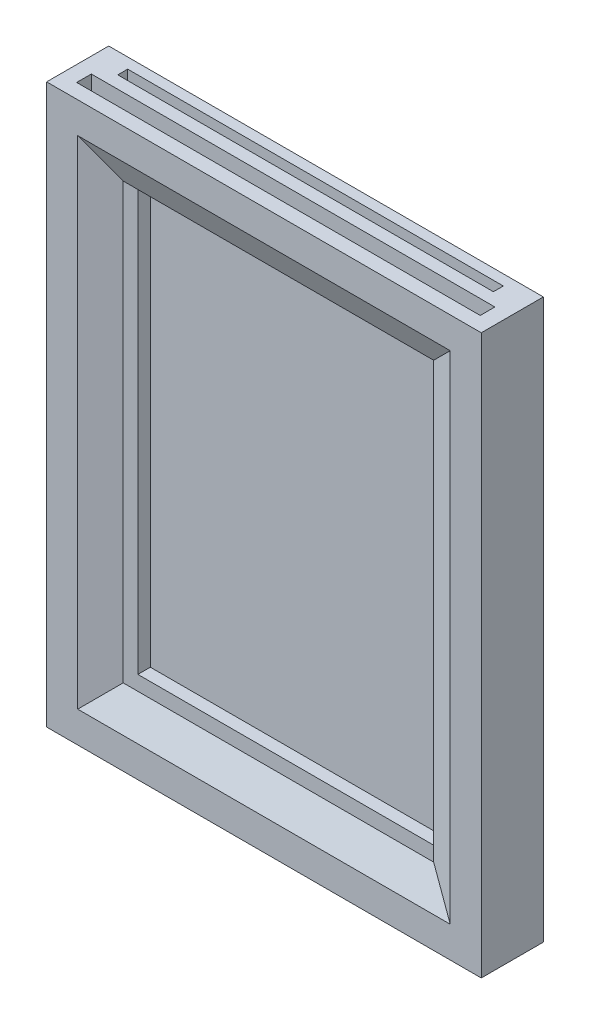
ISO-10303-21;
HEADER;
FILE_DESCRIPTION(('STEP AP214'),'2;1');
FILE_NAME('part.step','',(''),(''),'','','');
FILE_SCHEMA(('AUTOMOTIVE_DESIGN { 1 0 10303 214 1 1 1 1 }'));
ENDSEC;
DATA;
#1=APPLICATION_CONTEXT('core data for automotive mechanical design processes');
#2=APPLICATION_PROTOCOL_DEFINITION('international standard','automotive_design',2000,#1);
#3=PRODUCT_CONTEXT('',#1,'mechanical');
#4=PRODUCT('Part','Part','',(#3));
#5=PRODUCT_RELATED_PRODUCT_CATEGORY('part','',(#4));
#6=PRODUCT_DEFINITION_FORMATION('','',#4);
#7=PRODUCT_DEFINITION_CONTEXT('part definition',#1,'design');
#8=PRODUCT_DEFINITION('design','',#6,#7);
#9=PRODUCT_DEFINITION_SHAPE('','',#8);
#10=(LENGTH_UNIT() NAMED_UNIT(*) SI_UNIT(.MILLI.,.METRE.));
#11=(NAMED_UNIT(*) PLANE_ANGLE_UNIT() SI_UNIT($,.RADIAN.));
#12=(NAMED_UNIT(*) SI_UNIT($,.STERADIAN.) SOLID_ANGLE_UNIT());
#13=UNCERTAINTY_MEASURE_WITH_UNIT(LENGTH_MEASURE(1.E-05),#10,'distance_accuracy_value','');
#14=(GEOMETRIC_REPRESENTATION_CONTEXT(3) GLOBAL_UNCERTAINTY_ASSIGNED_CONTEXT((#13)) GLOBAL_UNIT_ASSIGNED_CONTEXT((#10,
#11,#12)) REPRESENTATION_CONTEXT('',''));
#15=CARTESIAN_POINT('',(0.,0.,0.));
#16=DIRECTION('',(0.,0.,1.));
#17=DIRECTION('',(1.,0.,0.));
#18=AXIS2_PLACEMENT_3D('',#15,#16,#17);
#19=CARTESIAN_POINT('',(0.,0.,12.7));
#20=DIRECTION('',(1.,0.,0.));
#21=DIRECTION('',(0.,0.,-1.));
#22=AXIS2_PLACEMENT_3D('',#19,#20,#21);
#23=PLANE('',#22);
#24=DIRECTION('',(0.,-1.,0.));
#25=VECTOR('',#24,1.);
#26=CARTESIAN_POINT('',(0.,0.,0.));
#27=LINE('',#26,#25);
#28=CARTESIAN_POINT('',(0.,114.3,0.));
#29=VERTEX_POINT('',#28);
#30=CARTESIAN_POINT('',(0.,0.,0.));
#31=VERTEX_POINT('',#30);
#32=EDGE_CURVE('E302',#29,#31,#27,.T.);
#33=ORIENTED_EDGE('',*,*,#32,.T.);
#34=DIRECTION('',(0.,0.,-1.));
#35=VECTOR('',#34,1.);
#36=CARTESIAN_POINT('',(0.,0.,12.7));
#37=LINE('',#36,#35);
#38=CARTESIAN_POINT('',(0.,0.,12.7));
#39=VERTEX_POINT('',#38);
#40=EDGE_CURVE('E352',#39,#31,#37,.T.);
#41=ORIENTED_EDGE('',*,*,#40,.F.);
#42=DIRECTION('',(0.,-1.,0.));
#43=VECTOR('',#42,1.);
#44=CARTESIAN_POINT('',(0.,0.,12.7));
#45=LINE('',#44,#43);
#46=CARTESIAN_POINT('',(0.,114.3,12.7));
#47=VERTEX_POINT('',#46);
#48=EDGE_CURVE('E313',#47,#39,#45,.T.);
#49=ORIENTED_EDGE('',*,*,#48,.F.);
#50=DIRECTION('',(0.,0.,-1.));
#51=VECTOR('',#50,1.);
#52=CARTESIAN_POINT('',(0.,114.3,12.7));
#53=LINE('',#52,#51);
#54=EDGE_CURVE('E326',#47,#29,#53,.T.);
#55=ORIENTED_EDGE('',*,*,#54,.T.);
#56=EDGE_LOOP('',(#33,#41,#49,#55));
#57=FACE_BOUND('',#56,.T.);
#58=ADVANCED_FACE('F52',(#57),#23,.F.);
#59=CARTESIAN_POINT('',(0.,0.,12.7));
#60=DIRECTION('',(0.,1.,0.));
#61=DIRECTION('',(0.,0.,1.));
#62=AXIS2_PLACEMENT_3D('',#59,#60,#61);
#63=PLANE('',#62);
#64=DIRECTION('',(1.,0.,0.));
#65=VECTOR('',#64,1.);
#66=CARTESIAN_POINT('',(0.,0.,0.));
#67=LINE('',#66,#65);
#68=CARTESIAN_POINT('',(88.9,0.,0.));
#69=VERTEX_POINT('',#68);
#70=EDGE_CURVE('E334',#31,#69,#67,.T.);
#71=ORIENTED_EDGE('',*,*,#70,.T.);
#72=DIRECTION('',(0.,0.,-1.));
#73=VECTOR('',#72,1.);
#74=CARTESIAN_POINT('',(88.9,0.,12.7));
#75=LINE('',#74,#73);
#76=CARTESIAN_POINT('',(88.9,0.,12.7));
#77=VERTEX_POINT('',#76);
#78=EDGE_CURVE('E350',#77,#69,#75,.T.);
#79=ORIENTED_EDGE('',*,*,#78,.F.);
#80=DIRECTION('',(1.,0.,0.));
#81=VECTOR('',#80,1.);
#82=CARTESIAN_POINT('',(0.,0.,12.7));
#83=LINE('',#82,#81);
#84=EDGE_CURVE('E319',#39,#77,#83,.T.);
#85=ORIENTED_EDGE('',*,*,#84,.F.);
#86=ORIENTED_EDGE('',*,*,#40,.T.);
#87=EDGE_LOOP('',(#71,#79,#85,#86));
#88=FACE_BOUND('',#87,.T.);
#89=ADVANCED_FACE('F441',(#88),#63,.F.);
#90=CARTESIAN_POINT('',(88.9,0.,12.7));
#91=DIRECTION('',(-1.,0.,0.));
#92=DIRECTION('',(0.,0.,1.));
#93=AXIS2_PLACEMENT_3D('',#90,#91,#92);
#94=PLANE('',#93);
#95=DIRECTION('',(0.,1.,0.));
#96=VECTOR('',#95,1.);
#97=CARTESIAN_POINT('',(88.9,0.,0.));
#98=LINE('',#97,#96);
#99=CARTESIAN_POINT('',(88.9,114.3,0.));
#100=VERTEX_POINT('',#99);
#101=EDGE_CURVE('E333',#69,#100,#98,.T.);
#102=ORIENTED_EDGE('',*,*,#101,.T.);
#103=DIRECTION('',(0.,0.,-1.));
#104=VECTOR('',#103,1.);
#105=CARTESIAN_POINT('',(88.9,114.3,12.7));
#106=LINE('',#105,#104);
#107=CARTESIAN_POINT('',(88.9,114.3,12.7));
#108=VERTEX_POINT('',#107);
#109=EDGE_CURVE('E345',#108,#100,#106,.T.);
#110=ORIENTED_EDGE('',*,*,#109,.F.);
#111=DIRECTION('',(0.,1.,0.));
#112=VECTOR('',#111,1.);
#113=CARTESIAN_POINT('',(88.9,0.,12.7));
#114=LINE('',#113,#112);
#115=EDGE_CURVE('E321',#77,#108,#114,.T.);
#116=ORIENTED_EDGE('',*,*,#115,.F.);
#117=ORIENTED_EDGE('',*,*,#78,.T.);
#118=EDGE_LOOP('',(#102,#110,#116,#117));
#119=FACE_BOUND('',#118,.T.);
#120=ADVANCED_FACE('F450',(#119),#94,.F.);
#121=CARTESIAN_POINT('',(0.,114.3,12.7));
#122=DIRECTION('',(0.,-1.,0.));
#123=DIRECTION('',(0.,0.,-1.));
#124=AXIS2_PLACEMENT_3D('',#121,#122,#123);
#125=PLANE('',#124);
#126=DIRECTION('',(1.,0.,0.));
#127=VECTOR('',#126,1.);
#128=CARTESIAN_POINT('',(3.175,114.3,9.73894637071576));
#129=LINE('',#128,#127);
#130=CARTESIAN_POINT('',(3.175,114.3,9.73894637071576));
#131=VERTEX_POINT('',#130);
#132=CARTESIAN_POINT('',(85.725,114.3,9.73894637071575));
#133=VERTEX_POINT('',#132);
#134=EDGE_CURVE('E227',#131,#133,#129,.T.);
#135=ORIENTED_EDGE('',*,*,#134,.F.);
#136=DIRECTION('',(0.,0.,1.));
#137=VECTOR('',#136,1.);
#138=CARTESIAN_POINT('',(3.175,114.3,9.73894637071576));
#139=LINE('',#138,#137);
#140=CARTESIAN_POINT('',(3.175,114.3,6.73894637071576));
#141=VERTEX_POINT('',#140);
#142=EDGE_CURVE('E67',#141,#131,#139,.T.);
#143=ORIENTED_EDGE('',*,*,#142,.F.);
#144=DIRECTION('',(-1.,0.,0.));
#145=VECTOR('',#144,1.);
#146=CARTESIAN_POINT('',(3.175,114.3,6.73894637071576));
#147=LINE('',#146,#145);
#148=CARTESIAN_POINT('',(85.725,114.3,6.73894637071575));
#149=VERTEX_POINT('',#148);
#150=EDGE_CURVE('E213',#149,#141,#147,.T.);
#151=ORIENTED_EDGE('',*,*,#150,.F.);
#152=DIRECTION('',(0.,0.,-1.));
#153=VECTOR('',#152,1.);
#154=CARTESIAN_POINT('',(85.725,114.3,9.73894637071575));
#155=LINE('',#154,#153);
#156=EDGE_CURVE('E216',#133,#149,#155,.T.);
#157=ORIENTED_EDGE('',*,*,#156,.F.);
#158=EDGE_LOOP('',(#135,#143,#151,#157));
#159=FACE_BOUND('',#158,.T.);
#160=DIRECTION('',(1.,0.,0.));
#161=VECTOR('',#160,1.);
#162=CARTESIAN_POINT('',(6.0325,114.3,4.19100000000001));
#163=LINE('',#162,#161);
#164=CARTESIAN_POINT('',(6.0325,114.3,4.19100000000001));
#165=VERTEX_POINT('',#164);
#166=CARTESIAN_POINT('',(82.8675,114.3,4.19099999999999));
#167=VERTEX_POINT('',#166);
#168=EDGE_CURVE('E288',#165,#167,#163,.T.);
#169=ORIENTED_EDGE('',*,*,#168,.F.);
#170=DIRECTION('',(0.,0.,1.));
#171=VECTOR('',#170,1.);
#172=CARTESIAN_POINT('',(6.0325,114.3,4.19100000000001));
#173=LINE('',#172,#171);
#174=CARTESIAN_POINT('',(6.0325,114.3,2.159));
#175=VERTEX_POINT('',#174);
#176=EDGE_CURVE('E259',#175,#165,#173,.T.);
#177=ORIENTED_EDGE('',*,*,#176,.F.);
#178=DIRECTION('',(-1.,0.,0.));
#179=VECTOR('',#178,1.);
#180=CARTESIAN_POINT('',(6.0325,114.3,2.159));
#181=LINE('',#180,#179);
#182=CARTESIAN_POINT('',(82.8675,114.3,2.159));
#183=VERTEX_POINT('',#182);
#184=EDGE_CURVE('E273',#183,#175,#181,.T.);
#185=ORIENTED_EDGE('',*,*,#184,.F.);
#186=DIRECTION('',(0.,0.,-1.));
#187=VECTOR('',#186,1.);
#188=CARTESIAN_POINT('',(82.8675,114.3,4.19099999999999));
#189=LINE('',#188,#187);
#190=EDGE_CURVE('E295',#167,#183,#189,.T.);
#191=ORIENTED_EDGE('',*,*,#190,.F.);
#192=EDGE_LOOP('',(#169,#177,#185,#191));
#193=FACE_BOUND('',#192,.T.);
#194=DIRECTION('',(-1.,0.,0.));
#195=VECTOR('',#194,1.);
#196=CARTESIAN_POINT('',(0.,114.3,0.));
#197=LINE('',#196,#195);
#198=EDGE_CURVE('E316',#100,#29,#197,.T.);
#199=ORIENTED_EDGE('',*,*,#198,.T.);
#200=ORIENTED_EDGE('',*,*,#54,.F.);
#201=DIRECTION('',(-1.,0.,0.));
#202=VECTOR('',#201,1.);
#203=CARTESIAN_POINT('',(0.,114.3,12.7));
#204=LINE('',#203,#202);
#205=EDGE_CURVE('E322',#108,#47,#204,.T.);
#206=ORIENTED_EDGE('',*,*,#205,.F.);
#207=ORIENTED_EDGE('',*,*,#109,.T.);
#208=EDGE_LOOP('',(#199,#200,#206,#207));
#209=FACE_BOUND('',#208,.T.);
#210=ADVANCED_FACE('F512',(#159,#193,#209),#125,.F.);
#211=CARTESIAN_POINT('',(0.,0.,12.7));
#212=DIRECTION('',(0.,0.,-1.));
#213=DIRECTION('',(-1.,0.,0.));
#214=AXIS2_PLACEMENT_3D('',#211,#212,#213);
#215=PLANE('',#214);
#216=DIRECTION('',(0.,-1.,0.));
#217=VECTOR('',#216,1.);
#218=CARTESIAN_POINT('',(82.55,0.,12.7));
#219=LINE('',#218,#217);
#220=CARTESIAN_POINT('',(82.55,107.95,12.7));
#221=VERTEX_POINT('',#220);
#222=CARTESIAN_POINT('',(82.55,6.34999999999999,12.7));
#223=VERTEX_POINT('',#222);
#224=EDGE_CURVE('E379',#221,#223,#219,.T.);
#225=ORIENTED_EDGE('',*,*,#224,.T.);
#226=DIRECTION('',(-1.,0.,0.));
#227=VECTOR('',#226,1.);
#228=CARTESIAN_POINT('',(0.,6.34999999999998,12.7));
#229=LINE('',#228,#227);
#230=CARTESIAN_POINT('',(6.35,6.34999999999998,12.7));
#231=VERTEX_POINT('',#230);
#232=EDGE_CURVE('E384',#223,#231,#229,.T.);
#233=ORIENTED_EDGE('',*,*,#232,.T.);
#234=DIRECTION('',(0.,1.,0.));
#235=VECTOR('',#234,1.);
#236=CARTESIAN_POINT('',(6.35,0.,12.7));
#237=LINE('',#236,#235);
#238=CARTESIAN_POINT('',(6.35,107.95,12.7));
#239=VERTEX_POINT('',#238);
#240=EDGE_CURVE('E372',#231,#239,#237,.T.);
#241=ORIENTED_EDGE('',*,*,#240,.T.);
#242=DIRECTION('',(1.,0.,0.));
#243=VECTOR('',#242,1.);
#244=CARTESIAN_POINT('',(0.,107.95,12.7));
#245=LINE('',#244,#243);
#246=EDGE_CURVE('E380',#239,#221,#245,.T.);
#247=ORIENTED_EDGE('',*,*,#246,.T.);
#248=EDGE_LOOP('',(#225,#233,#241,#247));
#249=FACE_BOUND('',#248,.T.);
#250=ORIENTED_EDGE('',*,*,#48,.T.);
#251=ORIENTED_EDGE('',*,*,#84,.T.);
#252=ORIENTED_EDGE('',*,*,#115,.T.);
#253=ORIENTED_EDGE('',*,*,#205,.T.);
#254=EDGE_LOOP('',(#250,#251,#252,#253));
#255=FACE_BOUND('',#254,.T.);
#256=ADVANCED_FACE('F420',(#249,#255),#215,.F.);
#257=CARTESIAN_POINT('',(0.,0.,0.));
#258=DIRECTION('',(0.,0.,-1.));
#259=DIRECTION('',(-1.,0.,0.));
#260=AXIS2_PLACEMENT_3D('',#257,#258,#259);
#261=PLANE('',#260);
#262=ORIENTED_EDGE('',*,*,#32,.F.);
#263=ORIENTED_EDGE('',*,*,#198,.F.);
#264=ORIENTED_EDGE('',*,*,#101,.F.);
#265=ORIENTED_EDGE('',*,*,#70,.F.);
#266=EDGE_LOOP('',(#262,#263,#264,#265));
#267=FACE_BOUND('',#266,.T.);
#268=ADVANCED_FACE('F510',(#267),#261,.T.);
#269=CARTESIAN_POINT('',(6.0325,8.89,4.19100000000001));
#270=DIRECTION('',(-1.,0.,0.));
#271=DIRECTION('',(0.,0.,1.));
#272=AXIS2_PLACEMENT_3D('',#269,#270,#271);
#273=PLANE('',#272);
#274=ORIENTED_EDGE('',*,*,#176,.T.);
#275=DIRECTION('',(0.,1.,0.));
#276=VECTOR('',#275,1.);
#277=CARTESIAN_POINT('',(6.0325,8.89,4.19100000000001));
#278=LINE('',#277,#276);
#279=CARTESIAN_POINT('',(6.0325,8.89,4.19100000000001));
#280=VERTEX_POINT('',#279);
#281=EDGE_CURVE('E289',#280,#165,#278,.T.);
#282=ORIENTED_EDGE('',*,*,#281,.F.);
#283=DIRECTION('',(0.,0.,1.));
#284=VECTOR('',#283,1.);
#285=CARTESIAN_POINT('',(6.0325,8.89,4.19100000000001));
#286=LINE('',#285,#284);
#287=CARTESIAN_POINT('',(6.0325,8.89,2.159));
#288=VERTEX_POINT('',#287);
#289=EDGE_CURVE('E268',#288,#280,#286,.T.);
#290=ORIENTED_EDGE('',*,*,#289,.F.);
#291=DIRECTION('',(0.,1.,0.));
#292=VECTOR('',#291,1.);
#293=CARTESIAN_POINT('',(6.0325,8.89,2.159));
#294=LINE('',#293,#292);
#295=EDGE_CURVE('E301',#288,#175,#294,.T.);
#296=ORIENTED_EDGE('',*,*,#295,.T.);
#297=EDGE_LOOP('',(#274,#282,#290,#296));
#298=FACE_BOUND('',#297,.T.);
#299=ADVANCED_FACE('F500',(#298),#273,.F.);
#300=CARTESIAN_POINT('',(6.0325,8.89,2.159));
#301=DIRECTION('',(0.,0.,-1.));
#302=DIRECTION('',(-1.,0.,0.));
#303=AXIS2_PLACEMENT_3D('',#300,#301,#302);
#304=PLANE('',#303);
#305=ORIENTED_EDGE('',*,*,#184,.T.);
#306=ORIENTED_EDGE('',*,*,#295,.F.);
#307=DIRECTION('',(-1.,0.,0.));
#308=VECTOR('',#307,1.);
#309=CARTESIAN_POINT('',(6.0325,8.89,2.159));
#310=LINE('',#309,#308);
#311=CARTESIAN_POINT('',(82.8675,8.89,2.159));
#312=VERTEX_POINT('',#311);
#313=EDGE_CURVE('E281',#312,#288,#310,.T.);
#314=ORIENTED_EDGE('',*,*,#313,.F.);
#315=DIRECTION('',(0.,1.,0.));
#316=VECTOR('',#315,1.);
#317=CARTESIAN_POINT('',(82.8675,8.89,2.159));
#318=LINE('',#317,#316);
#319=EDGE_CURVE('E304',#312,#183,#318,.T.);
#320=ORIENTED_EDGE('',*,*,#319,.T.);
#321=EDGE_LOOP('',(#305,#306,#314,#320));
#322=FACE_BOUND('',#321,.T.);
#323=ADVANCED_FACE('F491',(#322),#304,.F.);
#324=CARTESIAN_POINT('',(82.8675,8.89,4.19099999999999));
#325=DIRECTION('',(1.,0.,0.));
#326=DIRECTION('',(0.,0.,-1.));
#327=AXIS2_PLACEMENT_3D('',#324,#325,#326);
#328=PLANE('',#327);
#329=ORIENTED_EDGE('',*,*,#190,.T.);
#330=ORIENTED_EDGE('',*,*,#319,.F.);
#331=DIRECTION('',(0.,0.,-1.));
#332=VECTOR('',#331,1.);
#333=CARTESIAN_POINT('',(82.8675,8.89,4.19099999999999));
#334=LINE('',#333,#332);
#335=CARTESIAN_POINT('',(82.8675,8.89,4.19099999999999));
#336=VERTEX_POINT('',#335);
#337=EDGE_CURVE('E278',#336,#312,#334,.T.);
#338=ORIENTED_EDGE('',*,*,#337,.F.);
#339=DIRECTION('',(0.,1.,0.));
#340=VECTOR('',#339,1.);
#341=CARTESIAN_POINT('',(82.8675,8.89,4.19099999999999));
#342=LINE('',#341,#340);
#343=EDGE_CURVE('E308',#336,#167,#342,.T.);
#344=ORIENTED_EDGE('',*,*,#343,.T.);
#345=EDGE_LOOP('',(#329,#330,#338,#344));
#346=FACE_BOUND('',#345,.T.);
#347=ADVANCED_FACE('F496',(#346),#328,.F.);
#348=CARTESIAN_POINT('',(6.0325,8.89,4.19100000000001));
#349=DIRECTION('',(0.,0.,1.));
#350=DIRECTION('',(1.,0.,0.));
#351=AXIS2_PLACEMENT_3D('',#348,#349,#350);
#352=PLANE('',#351);
#353=DIRECTION('',(-1.,0.,0.));
#354=VECTOR('',#353,1.);
#355=CARTESIAN_POINT('',(6.03249999999998,101.6,4.19100000000001));
#356=LINE('',#355,#354);
#357=CARTESIAN_POINT('',(76.2,101.6,4.19099999999999));
#358=VERTEX_POINT('',#357);
#359=CARTESIAN_POINT('',(12.7,101.6,4.191));
#360=VERTEX_POINT('',#359);
#361=EDGE_CURVE('E361',#358,#360,#356,.T.);
#362=ORIENTED_EDGE('',*,*,#361,.T.);
#363=DIRECTION('',(0.,-1.,0.));
#364=VECTOR('',#363,1.);
#365=CARTESIAN_POINT('',(12.7,8.89,4.19100000000001));
#366=LINE('',#365,#364);
#367=CARTESIAN_POINT('',(12.7,12.7,4.191));
#368=VERTEX_POINT('',#367);
#369=EDGE_CURVE('E370',#360,#368,#366,.T.);
#370=ORIENTED_EDGE('',*,*,#369,.T.);
#371=DIRECTION('',(1.,0.,0.));
#372=VECTOR('',#371,1.);
#373=CARTESIAN_POINT('',(6.0325,12.7,4.19100000000001));
#374=LINE('',#373,#372);
#375=CARTESIAN_POINT('',(76.2,12.7,4.19099999999999));
#376=VERTEX_POINT('',#375);
#377=EDGE_CURVE('E353',#368,#376,#374,.T.);
#378=ORIENTED_EDGE('',*,*,#377,.T.);
#379=DIRECTION('',(0.,1.,0.));
#380=VECTOR('',#379,1.);
#381=CARTESIAN_POINT('',(76.2,8.89000000000002,4.19099999999999));
#382=LINE('',#381,#380);
#383=EDGE_CURVE('E360',#376,#358,#382,.T.);
#384=ORIENTED_EDGE('',*,*,#383,.T.);
#385=EDGE_LOOP('',(#362,#370,#378,#384));
#386=FACE_BOUND('',#385,.T.);
#387=ORIENTED_EDGE('',*,*,#168,.T.);
#388=ORIENTED_EDGE('',*,*,#343,.F.);
#389=DIRECTION('',(1.,0.,0.));
#390=VECTOR('',#389,1.);
#391=CARTESIAN_POINT('',(6.0325,8.89,4.19100000000001));
#392=LINE('',#391,#390);
#393=EDGE_CURVE('E274',#280,#336,#392,.T.);
#394=ORIENTED_EDGE('',*,*,#393,.F.);
#395=ORIENTED_EDGE('',*,*,#281,.T.);
#396=EDGE_LOOP('',(#387,#388,#394,#395));
#397=FACE_BOUND('',#396,.T.);
#398=ADVANCED_FACE('F493',(#386,#397),#352,.F.);
#399=CARTESIAN_POINT('',(0.,8.89,0.));
#400=DIRECTION('',(0.,-1.,0.));
#401=DIRECTION('',(0.,0.,-1.));
#402=AXIS2_PLACEMENT_3D('',#399,#400,#401);
#403=PLANE('',#402);
#404=ORIENTED_EDGE('',*,*,#289,.T.);
#405=ORIENTED_EDGE('',*,*,#393,.T.);
#406=ORIENTED_EDGE('',*,*,#337,.T.);
#407=ORIENTED_EDGE('',*,*,#313,.T.);
#408=EDGE_LOOP('',(#404,#405,#406,#407));
#409=FACE_BOUND('',#408,.T.);
#410=ADVANCED_FACE('F487',(#409),#403,.F.);
#411=CARTESIAN_POINT('',(12.7,12.7,3.175));
#412=DIRECTION('',(-1.,0.,0.));
#413=DIRECTION('',(0.,0.,1.));
#414=AXIS2_PLACEMENT_3D('',#411,#412,#413);
#415=PLANE('',#414);
#416=DIRECTION('',(0.,0.,1.));
#417=VECTOR('',#416,1.);
#418=CARTESIAN_POINT('',(12.7,101.6,3.175));
#419=LINE('',#418,#417);
#420=CARTESIAN_POINT('',(12.7,101.6,6.73894637071576));
#421=VERTEX_POINT('',#420);
#422=EDGE_CURVE('E255',#360,#421,#419,.T.);
#423=ORIENTED_EDGE('',*,*,#422,.T.);
#424=DIRECTION('',(0.,-1.,0.));
#425=VECTOR('',#424,1.);
#426=CARTESIAN_POINT('',(12.7,12.7,6.73894637071576));
#427=LINE('',#426,#425);
#428=CARTESIAN_POINT('',(12.7,12.7,6.73894637071576));
#429=VERTEX_POINT('',#428);
#430=EDGE_CURVE('E250',#421,#429,#427,.T.);
#431=ORIENTED_EDGE('',*,*,#430,.T.);
#432=DIRECTION('',(0.,0.,1.));
#433=VECTOR('',#432,1.);
#434=CARTESIAN_POINT('',(12.7,12.7,3.175));
#435=LINE('',#434,#433);
#436=EDGE_CURVE('E262',#368,#429,#435,.T.);
#437=ORIENTED_EDGE('',*,*,#436,.F.);
#438=ORIENTED_EDGE('',*,*,#369,.F.);
#439=EDGE_LOOP('',(#423,#431,#437,#438));
#440=FACE_BOUND('',#439,.T.);
#441=ADVANCED_FACE('F481',(#440),#415,.F.);
#442=CARTESIAN_POINT('',(12.7,101.6,3.175));
#443=DIRECTION('',(0.,1.,0.));
#444=DIRECTION('',(-1.,0.,0.));
#445=AXIS2_PLACEMENT_3D('',#442,#443,#444);
#446=PLANE('',#445);
#447=DIRECTION('',(0.,0.,1.));
#448=VECTOR('',#447,1.);
#449=CARTESIAN_POINT('',(76.2,101.6,3.175));
#450=LINE('',#449,#448);
#451=CARTESIAN_POINT('',(76.2,101.6,6.73894637071575));
#452=VERTEX_POINT('',#451);
#453=EDGE_CURVE('E256',#358,#452,#450,.T.);
#454=ORIENTED_EDGE('',*,*,#453,.T.);
#455=DIRECTION('',(-1.,0.,0.));
#456=VECTOR('',#455,1.);
#457=CARTESIAN_POINT('',(12.7,101.6,6.73894637071576));
#458=LINE('',#457,#456);
#459=EDGE_CURVE('E243',#452,#421,#458,.T.);
#460=ORIENTED_EDGE('',*,*,#459,.T.);
#461=ORIENTED_EDGE('',*,*,#422,.F.);
#462=ORIENTED_EDGE('',*,*,#361,.F.);
#463=EDGE_LOOP('',(#454,#460,#461,#462));
#464=FACE_BOUND('',#463,.T.);
#465=ADVANCED_FACE('F479',(#464),#446,.F.);
#466=CARTESIAN_POINT('',(76.2,12.7,3.175));
#467=DIRECTION('',(1.,0.,0.));
#468=DIRECTION('',(0.,1.,0.));
#469=AXIS2_PLACEMENT_3D('',#466,#467,#468);
#470=PLANE('',#469);
#471=DIRECTION('',(0.,0.,1.));
#472=VECTOR('',#471,1.);
#473=CARTESIAN_POINT('',(76.2,12.7,3.175));
#474=LINE('',#473,#472);
#475=CARTESIAN_POINT('',(76.2,12.7,6.73894637071576));
#476=VERTEX_POINT('',#475);
#477=EDGE_CURVE('E263',#376,#476,#474,.T.);
#478=ORIENTED_EDGE('',*,*,#477,.T.);
#479=DIRECTION('',(0.,1.,0.));
#480=VECTOR('',#479,1.);
#481=CARTESIAN_POINT('',(76.2,12.7,6.73894637071575));
#482=LINE('',#481,#480);
#483=EDGE_CURVE('E76',#476,#452,#482,.T.);
#484=ORIENTED_EDGE('',*,*,#483,.T.);
#485=ORIENTED_EDGE('',*,*,#453,.F.);
#486=ORIENTED_EDGE('',*,*,#383,.F.);
#487=EDGE_LOOP('',(#478,#484,#485,#486));
#488=FACE_BOUND('',#487,.T.);
#489=ADVANCED_FACE('F475',(#488),#470,.F.);
#490=CARTESIAN_POINT('',(12.7,12.7,3.175));
#491=DIRECTION('',(0.,-1.,0.));
#492=DIRECTION('',(1.,0.,0.));
#493=AXIS2_PLACEMENT_3D('',#490,#491,#492);
#494=PLANE('',#493);
#495=ORIENTED_EDGE('',*,*,#436,.T.);
#496=DIRECTION('',(1.,0.,0.));
#497=VECTOR('',#496,1.);
#498=CARTESIAN_POINT('',(12.7,12.7,6.73894637071576));
#499=LINE('',#498,#497);
#500=EDGE_CURVE('E11',#429,#476,#499,.T.);
#501=ORIENTED_EDGE('',*,*,#500,.T.);
#502=ORIENTED_EDGE('',*,*,#477,.F.);
#503=ORIENTED_EDGE('',*,*,#377,.F.);
#504=EDGE_LOOP('',(#495,#501,#502,#503));
#505=FACE_BOUND('',#504,.T.);
#506=ADVANCED_FACE('F469',(#505),#494,.F.);
#507=CARTESIAN_POINT('',(12.7,101.6,9.73894637071577));
#508=DIRECTION('',(0.,0.422618261740697,-0.906307787036651));
#509=DIRECTION('',(-1.,0.,0.));
#510=AXIS2_PLACEMENT_3D('',#507,#508,#509);
#511=PLANE('',#510);
#512=DIRECTION('',(0.671542934237818,0.671542934237819,0.313145613014972));
#513=VECTOR('',#512,1.);
#514=CARTESIAN_POINT('',(36.1087747765507,61.5087747765507,-8.95589897579538));
#515=LINE('',#514,#513);
#516=CARTESIAN_POINT('',(76.2,101.6,9.73894637071576));
#517=VERTEX_POINT('',#516);
#518=EDGE_CURVE('E402',#221,#517,#515,.F.);
#519=ORIENTED_EDGE('',*,*,#518,.F.);
#520=ORIENTED_EDGE('',*,*,#246,.F.);
#521=DIRECTION('',(-0.671542934237818,0.671542934237819,0.313145613014972));
#522=VECTOR('',#521,1.);
#523=CARTESIAN_POINT('',(12.7,101.6,9.73894637071577));
#524=LINE('',#523,#522);
#525=CARTESIAN_POINT('',(12.7,101.6,9.73894637071576));
#526=VERTEX_POINT('',#525);
#527=EDGE_CURVE('E266',#526,#239,#524,.T.);
#528=ORIENTED_EDGE('',*,*,#527,.F.);
#529=DIRECTION('',(-1.,0.,0.));
#530=VECTOR('',#529,1.);
#531=CARTESIAN_POINT('',(12.7,101.6,9.73894637071577));
#532=LINE('',#531,#530);
#533=EDGE_CURVE('E387',#517,#526,#532,.T.);
#534=ORIENTED_EDGE('',*,*,#533,.F.);
#535=EDGE_LOOP('',(#519,#520,#528,#534));
#536=FACE_BOUND('',#535,.T.);
#537=ADVANCED_FACE('F57',(#536),#511,.F.);
#538=CARTESIAN_POINT('',(12.7,12.7,9.73894637071577));
#539=DIRECTION('',(-0.422618261740698,0.,-0.906307787036651));
#540=DIRECTION('',(0.,-1.,0.));
#541=AXIS2_PLACEMENT_3D('',#538,#539,#540);
#542=PLANE('',#541);
#543=ORIENTED_EDGE('',*,*,#527,.T.);
#544=ORIENTED_EDGE('',*,*,#240,.F.);
#545=DIRECTION('',(0.671542934237818,0.671542934237818,-0.313145613014972));
#546=VECTOR('',#545,1.);
#547=CARTESIAN_POINT('',(12.7,12.7,9.73894637071577));
#548=LINE('',#547,#546);
#549=CARTESIAN_POINT('',(12.7,12.7,9.73894637071576));
#550=VERTEX_POINT('',#549);
#551=EDGE_CURVE('E400',#550,#231,#548,.F.);
#552=ORIENTED_EDGE('',*,*,#551,.F.);
#553=DIRECTION('',(0.,-1.,0.));
#554=VECTOR('',#553,1.);
#555=CARTESIAN_POINT('',(12.7,12.7,9.73894637071577));
#556=LINE('',#555,#554);
#557=EDGE_CURVE('E65',#526,#550,#556,.T.);
#558=ORIENTED_EDGE('',*,*,#557,.F.);
#559=EDGE_LOOP('',(#543,#544,#552,#558));
#560=FACE_BOUND('',#559,.T.);
#561=ADVANCED_FACE('F407',(#560),#542,.F.);
#562=CARTESIAN_POINT('',(76.2,12.7,9.73894637071577));
#563=DIRECTION('',(0.422618261740698,0.,-0.906307787036651));
#564=DIRECTION('',(0.,1.,0.));
#565=AXIS2_PLACEMENT_3D('',#562,#563,#564);
#566=PLANE('',#565);
#567=ORIENTED_EDGE('',*,*,#518,.T.);
#568=DIRECTION('',(0.,1.,0.));
#569=VECTOR('',#568,1.);
#570=CARTESIAN_POINT('',(76.2,12.7,9.73894637071577));
#571=LINE('',#570,#569);
#572=CARTESIAN_POINT('',(76.2,12.7,9.73894637071576));
#573=VERTEX_POINT('',#572);
#574=EDGE_CURVE('E386',#573,#517,#571,.T.);
#575=ORIENTED_EDGE('',*,*,#574,.F.);
#576=DIRECTION('',(0.671542934237818,-0.671542934237818,0.313145613014972));
#577=VECTOR('',#576,1.);
#578=CARTESIAN_POINT('',(47.5634105546791,41.3365894453209,-3.6145145910779));
#579=LINE('',#578,#577);
#580=EDGE_CURVE('E252',#223,#573,#579,.F.);
#581=ORIENTED_EDGE('',*,*,#580,.F.);
#582=ORIENTED_EDGE('',*,*,#224,.F.);
#583=EDGE_LOOP('',(#567,#575,#581,#582));
#584=FACE_BOUND('',#583,.T.);
#585=ADVANCED_FACE('F430',(#584),#566,.F.);
#586=CARTESIAN_POINT('',(12.7,12.7,9.73894637071577));
#587=DIRECTION('',(0.,-0.422618261740698,-0.906307787036651));
#588=DIRECTION('',(1.,0.,0.));
#589=AXIS2_PLACEMENT_3D('',#586,#587,#588);
#590=PLANE('',#589);
#591=ORIENTED_EDGE('',*,*,#551,.T.);
#592=ORIENTED_EDGE('',*,*,#232,.F.);
#593=ORIENTED_EDGE('',*,*,#580,.T.);
#594=DIRECTION('',(1.,0.,0.));
#595=VECTOR('',#594,1.);
#596=CARTESIAN_POINT('',(12.7,12.7,9.73894637071577));
#597=LINE('',#596,#595);
#598=EDGE_CURVE('E371',#550,#573,#597,.T.);
#599=ORIENTED_EDGE('',*,*,#598,.F.);
#600=EDGE_LOOP('',(#591,#592,#593,#599));
#601=FACE_BOUND('',#600,.T.);
#602=ADVANCED_FACE('F421',(#601),#590,.F.);
#603=CARTESIAN_POINT('',(3.175,5.08,6.73894637071576));
#604=DIRECTION('',(0.,0.,-1.));
#605=DIRECTION('',(-1.,0.,0.));
#606=AXIS2_PLACEMENT_3D('',#603,#604,#605);
#607=PLANE('',#606);
#608=ORIENTED_EDGE('',*,*,#150,.T.);
#609=DIRECTION('',(0.,1.,0.));
#610=VECTOR('',#609,1.);
#611=CARTESIAN_POINT('',(3.175,5.08,6.73894637071576));
#612=LINE('',#611,#610);
#613=CARTESIAN_POINT('',(3.175,5.08,6.73894637071576));
#614=VERTEX_POINT('',#613);
#615=EDGE_CURVE('E231',#614,#141,#612,.T.);
#616=ORIENTED_EDGE('',*,*,#615,.F.);
#617=DIRECTION('',(-1.,0.,0.));
#618=VECTOR('',#617,1.);
#619=CARTESIAN_POINT('',(3.175,5.08,6.73894637071576));
#620=LINE('',#619,#618);
#621=CARTESIAN_POINT('',(85.725,5.08,6.73894637071575));
#622=VERTEX_POINT('',#621);
#623=EDGE_CURVE('E197',#622,#614,#620,.T.);
#624=ORIENTED_EDGE('',*,*,#623,.F.);
#625=DIRECTION('',(0.,1.,0.));
#626=VECTOR('',#625,1.);
#627=CARTESIAN_POINT('',(85.725,5.08,6.73894637071575));
#628=LINE('',#627,#626);
#629=EDGE_CURVE('E236',#622,#149,#628,.T.);
#630=ORIENTED_EDGE('',*,*,#629,.T.);
#631=EDGE_LOOP('',(#608,#616,#624,#630));
#632=FACE_BOUND('',#631,.T.);
#633=ORIENTED_EDGE('',*,*,#459,.F.);
#634=ORIENTED_EDGE('',*,*,#483,.F.);
#635=ORIENTED_EDGE('',*,*,#500,.F.);
#636=ORIENTED_EDGE('',*,*,#430,.F.);
#637=EDGE_LOOP('',(#633,#634,#635,#636));
#638=FACE_BOUND('',#637,.T.);
#639=ADVANCED_FACE('F456',(#632,#638),#607,.F.);
#640=CARTESIAN_POINT('',(3.175,5.08,9.73894637071576));
#641=DIRECTION('',(-1.,0.,0.));
#642=DIRECTION('',(0.,0.,1.));
#643=AXIS2_PLACEMENT_3D('',#640,#641,#642);
#644=PLANE('',#643);
#645=ORIENTED_EDGE('',*,*,#142,.T.);
#646=DIRECTION('',(0.,1.,0.));
#647=VECTOR('',#646,1.);
#648=CARTESIAN_POINT('',(3.175,5.08,9.73894637071576));
#649=LINE('',#648,#647);
#650=CARTESIAN_POINT('',(3.175,5.08,9.73894637071576));
#651=VERTEX_POINT('',#650);
#652=EDGE_CURVE('E186',#651,#131,#649,.T.);
#653=ORIENTED_EDGE('',*,*,#652,.F.);
#654=DIRECTION('',(0.,0.,1.));
#655=VECTOR('',#654,1.);
#656=CARTESIAN_POINT('',(3.175,5.08,9.73894637071576));
#657=LINE('',#656,#655);
#658=EDGE_CURVE('E195',#614,#651,#657,.T.);
#659=ORIENTED_EDGE('',*,*,#658,.F.);
#660=ORIENTED_EDGE('',*,*,#615,.T.);
#661=EDGE_LOOP('',(#645,#653,#659,#660));
#662=FACE_BOUND('',#661,.T.);
#663=ADVANCED_FACE('F194',(#662),#644,.F.);
#664=CARTESIAN_POINT('',(85.725,5.08,9.73894637071575));
#665=DIRECTION('',(1.,0.,0.));
#666=DIRECTION('',(0.,0.,-1.));
#667=AXIS2_PLACEMENT_3D('',#664,#665,#666);
#668=PLANE('',#667);
#669=ORIENTED_EDGE('',*,*,#156,.T.);
#670=ORIENTED_EDGE('',*,*,#629,.F.);
#671=DIRECTION('',(0.,0.,-1.));
#672=VECTOR('',#671,1.);
#673=CARTESIAN_POINT('',(85.725,5.08,9.73894637071575));
#674=LINE('',#673,#672);
#675=CARTESIAN_POINT('',(85.725,5.08,9.73894637071575));
#676=VERTEX_POINT('',#675);
#677=EDGE_CURVE('E209',#676,#622,#674,.T.);
#678=ORIENTED_EDGE('',*,*,#677,.F.);
#679=DIRECTION('',(0.,1.,0.));
#680=VECTOR('',#679,1.);
#681=CARTESIAN_POINT('',(85.725,5.08,9.73894637071575));
#682=LINE('',#681,#680);
#683=EDGE_CURVE('E199',#676,#133,#682,.T.);
#684=ORIENTED_EDGE('',*,*,#683,.T.);
#685=EDGE_LOOP('',(#669,#670,#678,#684));
#686=FACE_BOUND('',#685,.T.);
#687=ADVANCED_FACE('F427',(#686),#668,.F.);
#688=CARTESIAN_POINT('',(3.175,5.08,9.73894637071576));
#689=DIRECTION('',(0.,0.,1.));
#690=DIRECTION('',(1.,0.,0.));
#691=AXIS2_PLACEMENT_3D('',#688,#689,#690);
#692=PLANE('',#691);
#693=ORIENTED_EDGE('',*,*,#533,.T.);
#694=ORIENTED_EDGE('',*,*,#557,.T.);
#695=ORIENTED_EDGE('',*,*,#598,.T.);
#696=ORIENTED_EDGE('',*,*,#574,.T.);
#697=EDGE_LOOP('',(#693,#694,#695,#696));
#698=FACE_BOUND('',#697,.T.);
#699=ORIENTED_EDGE('',*,*,#134,.T.);
#700=ORIENTED_EDGE('',*,*,#683,.F.);
#701=DIRECTION('',(1.,0.,0.));
#702=VECTOR('',#701,1.);
#703=CARTESIAN_POINT('',(3.175,5.08,9.73894637071576));
#704=LINE('',#703,#702);
#705=EDGE_CURVE('E205',#651,#676,#704,.T.);
#706=ORIENTED_EDGE('',*,*,#705,.F.);
#707=ORIENTED_EDGE('',*,*,#652,.T.);
#708=EDGE_LOOP('',(#699,#700,#706,#707));
#709=FACE_BOUND('',#708,.T.);
#710=ADVANCED_FACE('F201',(#698,#709),#692,.F.);
#711=CARTESIAN_POINT('',(0.,5.08,0.));
#712=DIRECTION('',(0.,-1.,0.));
#713=DIRECTION('',(0.,0.,-1.));
#714=AXIS2_PLACEMENT_3D('',#711,#712,#713);
#715=PLANE('',#714);
#716=ORIENTED_EDGE('',*,*,#658,.T.);
#717=ORIENTED_EDGE('',*,*,#705,.T.);
#718=ORIENTED_EDGE('',*,*,#677,.T.);
#719=ORIENTED_EDGE('',*,*,#623,.T.);
#720=EDGE_LOOP('',(#716,#717,#718,#719));
#721=FACE_BOUND('',#720,.T.);
#722=ADVANCED_FACE('F214',(#721),#715,.F.);
#723=CLOSED_SHELL('',(#58,#89,#120,#210,#256,#268,#299,#323,#347,#398,#410,#441,#465,#489,#506,
#537,#561,#585,#602,#639,#663,#687,#710,#722));
#724=MANIFOLD_SOLID_BREP('B2',#723);
#725=ADVANCED_BREP_SHAPE_REPRESENTATION('',(#18,#724),#14);
#726=SHAPE_DEFINITION_REPRESENTATION(#9,#725);
ENDSEC;
END-ISO-10303-21;
